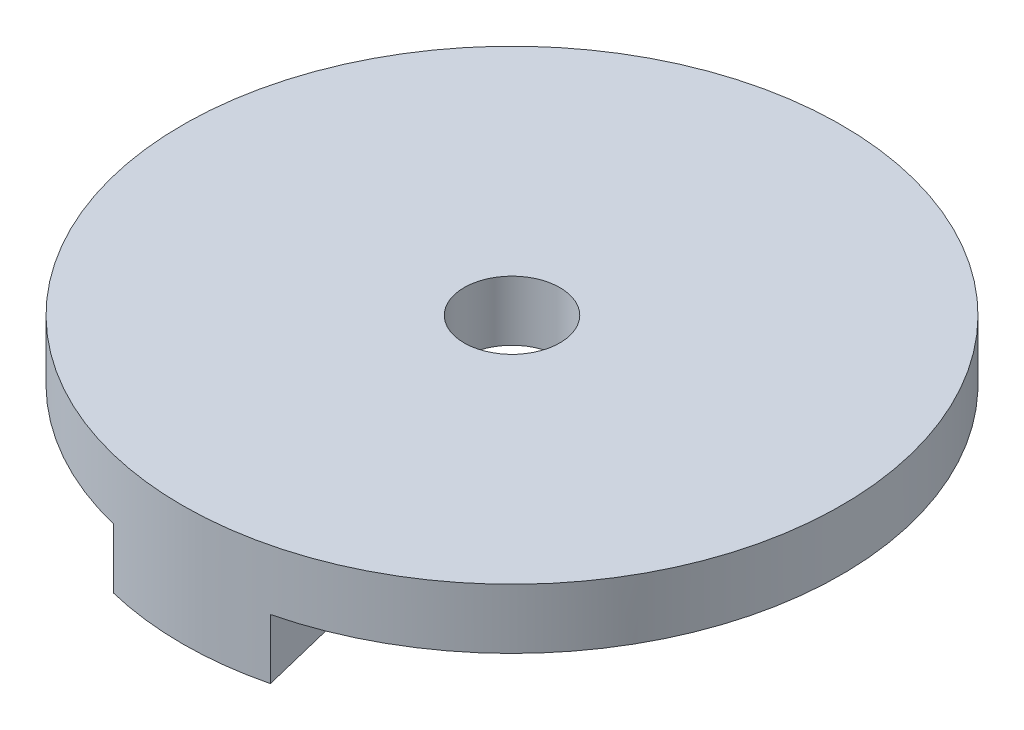
ISO-10303-21;
HEADER;
FILE_DESCRIPTION(('STEP AP214'),'2;1');
FILE_NAME('part.step','',(''),(''),'','','');
FILE_SCHEMA(('AUTOMOTIVE_DESIGN { 1 0 10303 214 1 1 1 1 }'));
ENDSEC;
DATA;
#1=APPLICATION_CONTEXT('core data for automotive mechanical design processes');
#2=APPLICATION_PROTOCOL_DEFINITION('international standard','automotive_design',2000,#1);
#3=PRODUCT_CONTEXT('',#1,'mechanical');
#4=PRODUCT('Part','Part','',(#3));
#5=PRODUCT_RELATED_PRODUCT_CATEGORY('part','',(#4));
#6=PRODUCT_DEFINITION_FORMATION('','',#4);
#7=PRODUCT_DEFINITION_CONTEXT('part definition',#1,'design');
#8=PRODUCT_DEFINITION('design','',#6,#7);
#9=PRODUCT_DEFINITION_SHAPE('','',#8);
#10=(LENGTH_UNIT() NAMED_UNIT(*) SI_UNIT(.MILLI.,.METRE.));
#11=(NAMED_UNIT(*) PLANE_ANGLE_UNIT() SI_UNIT($,.RADIAN.));
#12=(NAMED_UNIT(*) SI_UNIT($,.STERADIAN.) SOLID_ANGLE_UNIT());
#13=UNCERTAINTY_MEASURE_WITH_UNIT(LENGTH_MEASURE(1.E-05),#10,'distance_accuracy_value','');
#14=(GEOMETRIC_REPRESENTATION_CONTEXT(3) GLOBAL_UNCERTAINTY_ASSIGNED_CONTEXT((#13)) GLOBAL_UNIT_ASSIGNED_CONTEXT((#10,
#11,#12)) REPRESENTATION_CONTEXT('',''));
#15=CARTESIAN_POINT('',(0.,0.,0.));
#16=DIRECTION('',(0.,0.,1.));
#17=DIRECTION('',(1.,0.,0.));
#18=AXIS2_PLACEMENT_3D('',#15,#16,#17);
#19=CARTESIAN_POINT('',(0.,0.,0.));
#20=DIRECTION('',(0.,1.,0.));
#21=DIRECTION('',(0.,0.,1.));
#22=AXIS2_PLACEMENT_3D('',#19,#20,#21);
#23=PLANE('',#22);
#24=CARTESIAN_POINT('',(0.,0.,0.));
#25=DIRECTION('',(0.,1.,0.));
#26=DIRECTION('',(0.,0.,1.));
#27=AXIS2_PLACEMENT_3D('',#24,#25,#26);
#28=CIRCLE('',#27,5.08);
#29=CARTESIAN_POINT('',(0.,0.,5.08));
#30=VERTEX_POINT('',#29);
#31=EDGE_CURVE('E94',#30,#30,#28,.T.);
#32=ORIENTED_EDGE('',*,*,#31,.T.);
#33=EDGE_LOOP('',(#32));
#34=FACE_BOUND('',#33,.T.);
#35=DIRECTION('',(0.238095238095238,0.,-0.971241812112911));
#36=VECTOR('',#35,1.);
#37=CARTESIAN_POINT('',(-6.35,0.,25.9030191290513));
#38=LINE('',#37,#36);
#39=CARTESIAN_POINT('',(-8.3154761904762,0.,33.9206202880434));
#40=VERTEX_POINT('',#39);
#41=CARTESIAN_POINT('',(-6.35,0.,25.9030191290513));
#42=VERTEX_POINT('',#41);
#43=EDGE_CURVE('E91',#40,#42,#38,.T.);
#44=ORIENTED_EDGE('',*,*,#43,.F.);
#45=CARTESIAN_POINT('',(0.,0.,0.));
#46=DIRECTION('',(0.,1.,0.));
#47=DIRECTION('',(0.,0.,1.));
#48=AXIS2_PLACEMENT_3D('',#45,#46,#47);
#49=CIRCLE('',#48,34.925);
#50=CARTESIAN_POINT('',(8.31547619047619,0.,33.9206202880434));
#51=VERTEX_POINT('',#50);
#52=EDGE_CURVE('E37',#51,#40,#49,.T.);
#53=ORIENTED_EDGE('',*,*,#52,.F.);
#54=DIRECTION('',(0.238095238095238,0.,0.971241812112911));
#55=VECTOR('',#54,1.);
#56=CARTESIAN_POINT('',(6.35,0.,25.9030191290513));
#57=LINE('',#56,#55);
#58=CARTESIAN_POINT('',(6.35,0.,25.9030191290513));
#59=VERTEX_POINT('',#58);
#60=EDGE_CURVE('E53',#59,#51,#57,.T.);
#61=ORIENTED_EDGE('',*,*,#60,.F.);
#62=CARTESIAN_POINT('',(0.,0.,0.));
#63=DIRECTION('',(0.,1.,0.));
#64=DIRECTION('',(0.,0.,-1.));
#65=AXIS2_PLACEMENT_3D('',#62,#63,#64);
#66=CIRCLE('',#65,26.67);
#67=EDGE_CURVE('E48',#42,#59,#66,.T.);
#68=ORIENTED_EDGE('',*,*,#67,.F.);
#69=EDGE_LOOP('',(#44,#53,#61,#68));
#70=FACE_BOUND('',#69,.T.);
#71=ADVANCED_FACE('F33',(#34,#70),#23,.F.);
#72=CARTESIAN_POINT('',(0.,6.35,0.));
#73=DIRECTION('',(0.,1.,0.));
#74=DIRECTION('',(0.,0.,1.));
#75=AXIS2_PLACEMENT_3D('',#72,#73,#74);
#76=PLANE('',#75);
#77=CARTESIAN_POINT('',(0.,6.35,0.));
#78=DIRECTION('',(0.,1.,0.));
#79=DIRECTION('',(0.,0.,1.));
#80=AXIS2_PLACEMENT_3D('',#77,#78,#79);
#81=CIRCLE('',#80,34.925);
#82=CARTESIAN_POINT('',(0.,6.35,34.925));
#83=VERTEX_POINT('',#82);
#84=EDGE_CURVE('E11',#83,#83,#81,.T.);
#85=ORIENTED_EDGE('',*,*,#84,.T.);
#86=EDGE_LOOP('',(#85));
#87=FACE_BOUND('',#86,.T.);
#88=CARTESIAN_POINT('',(0.,6.35,0.));
#89=DIRECTION('',(0.,1.,0.));
#90=DIRECTION('',(0.,0.,1.));
#91=AXIS2_PLACEMENT_3D('',#88,#89,#90);
#92=CIRCLE('',#91,5.08);
#93=CARTESIAN_POINT('',(0.,6.35,5.08));
#94=VERTEX_POINT('',#93);
#95=EDGE_CURVE('E97',#94,#94,#92,.T.);
#96=ORIENTED_EDGE('',*,*,#95,.F.);
#97=EDGE_LOOP('',(#96));
#98=FACE_BOUND('',#97,.T.);
#99=ADVANCED_FACE('F120',(#87,#98),#76,.T.);
#100=CARTESIAN_POINT('',(0.,6.35,0.));
#101=DIRECTION('',(0.,-1.,0.));
#102=DIRECTION('',(0.,0.,-1.));
#103=AXIS2_PLACEMENT_3D('',#100,#101,#102);
#104=CYLINDRICAL_SURFACE('',#103,34.925);
#105=ORIENTED_EDGE('',*,*,#84,.F.);
#106=EDGE_LOOP('',(#105));
#107=FACE_BOUND('',#106,.T.);
#108=ORIENTED_EDGE('',*,*,#52,.T.);
#109=DIRECTION('',(0.,1.,0.));
#110=VECTOR('',#109,1.);
#111=CARTESIAN_POINT('',(-8.31547619047618,-6.35,33.9206202880434));
#112=LINE('',#111,#110);
#113=CARTESIAN_POINT('',(-8.31547619047618,-6.35,33.9206202880434));
#114=VERTEX_POINT('',#113);
#115=EDGE_CURVE('E99',#114,#40,#112,.T.);
#116=ORIENTED_EDGE('',*,*,#115,.F.);
#117=CARTESIAN_POINT('',(0.,-6.35,0.));
#118=DIRECTION('',(0.,-1.,0.));
#119=DIRECTION('',(0.,0.,-1.));
#120=AXIS2_PLACEMENT_3D('',#117,#118,#119);
#121=CIRCLE('',#120,34.925);
#122=CARTESIAN_POINT('',(8.31547619047619,-6.35,33.9206202880434));
#123=VERTEX_POINT('',#122);
#124=EDGE_CURVE('E81',#123,#114,#121,.T.);
#125=ORIENTED_EDGE('',*,*,#124,.F.);
#126=DIRECTION('',(0.,1.,0.));
#127=VECTOR('',#126,1.);
#128=CARTESIAN_POINT('',(8.31547619047619,-6.35,33.9206202880434));
#129=LINE('',#128,#127);
#130=EDGE_CURVE('E78',#123,#51,#129,.T.);
#131=ORIENTED_EDGE('',*,*,#130,.T.);
#132=EDGE_LOOP('',(#108,#116,#125,#131));
#133=FACE_BOUND('',#132,.T.);
#134=ADVANCED_FACE('F35',(#107,#133),#104,.T.);
#135=CARTESIAN_POINT('',(0.,6.35,0.));
#136=DIRECTION('',(0.,-1.,0.));
#137=DIRECTION('',(0.,0.,-1.));
#138=AXIS2_PLACEMENT_3D('',#135,#136,#137);
#139=CYLINDRICAL_SURFACE('',#138,5.08);
#140=ORIENTED_EDGE('',*,*,#95,.T.);
#141=EDGE_LOOP('',(#140));
#142=FACE_BOUND('',#141,.T.);
#143=ORIENTED_EDGE('',*,*,#31,.F.);
#144=EDGE_LOOP('',(#143));
#145=FACE_BOUND('',#144,.T.);
#146=ADVANCED_FACE('F128',(#142,#145),#139,.F.);
#147=CARTESIAN_POINT('',(0.,-6.35,0.));
#148=DIRECTION('',(0.,1.,0.));
#149=DIRECTION('',(0.,0.,1.));
#150=AXIS2_PLACEMENT_3D('',#147,#148,#149);
#151=CYLINDRICAL_SURFACE('',#150,26.67);
#152=ORIENTED_EDGE('',*,*,#67,.T.);
#153=DIRECTION('',(0.,1.,0.));
#154=VECTOR('',#153,1.);
#155=CARTESIAN_POINT('',(6.35,-6.35,25.9030191290513));
#156=LINE('',#155,#154);
#157=CARTESIAN_POINT('',(6.35,-6.35,25.9030191290513));
#158=VERTEX_POINT('',#157);
#159=EDGE_CURVE('E76',#158,#59,#156,.T.);
#160=ORIENTED_EDGE('',*,*,#159,.F.);
#161=CARTESIAN_POINT('',(0.,-6.35,0.));
#162=DIRECTION('',(0.,1.,0.));
#163=DIRECTION('',(0.,0.,-1.));
#164=AXIS2_PLACEMENT_3D('',#161,#162,#163);
#165=CIRCLE('',#164,26.67);
#166=CARTESIAN_POINT('',(-6.35,-6.35,25.9030191290513));
#167=VERTEX_POINT('',#166);
#168=EDGE_CURVE('E82',#167,#158,#165,.T.);
#169=ORIENTED_EDGE('',*,*,#168,.F.);
#170=DIRECTION('',(0.,1.,0.));
#171=VECTOR('',#170,1.);
#172=CARTESIAN_POINT('',(-6.35,-6.35,25.9030191290513));
#173=LINE('',#172,#171);
#174=EDGE_CURVE('E112',#167,#42,#173,.T.);
#175=ORIENTED_EDGE('',*,*,#174,.T.);
#176=EDGE_LOOP('',(#152,#160,#169,#175));
#177=FACE_BOUND('',#176,.T.);
#178=ADVANCED_FACE('F93',(#177),#151,.F.);
#179=CARTESIAN_POINT('',(6.35,-6.35,25.9030191290513));
#180=DIRECTION('',(-0.971241812112911,0.,0.238095238095238));
#181=DIRECTION('',(0.238095238095238,0.,0.971241812112911));
#182=AXIS2_PLACEMENT_3D('',#179,#180,#181);
#183=PLANE('',#182);
#184=ORIENTED_EDGE('',*,*,#60,.T.);
#185=ORIENTED_EDGE('',*,*,#130,.F.);
#186=DIRECTION('',(0.238095238095238,0.,0.971241812112911));
#187=VECTOR('',#186,1.);
#188=CARTESIAN_POINT('',(6.35,-6.35,25.9030191290513));
#189=LINE('',#188,#187);
#190=EDGE_CURVE('E72',#158,#123,#189,.T.);
#191=ORIENTED_EDGE('',*,*,#190,.F.);
#192=ORIENTED_EDGE('',*,*,#159,.T.);
#193=EDGE_LOOP('',(#184,#185,#191,#192));
#194=FACE_BOUND('',#193,.T.);
#195=ADVANCED_FACE('F74',(#194),#183,.F.);
#196=CARTESIAN_POINT('',(-6.35,-6.35,25.9030191290513));
#197=DIRECTION('',(0.971241812112911,0.,0.238095238095238));
#198=DIRECTION('',(0.238095238095238,0.,-0.971241812112911));
#199=AXIS2_PLACEMENT_3D('',#196,#197,#198);
#200=PLANE('',#199);
#201=ORIENTED_EDGE('',*,*,#43,.T.);
#202=ORIENTED_EDGE('',*,*,#174,.F.);
#203=DIRECTION('',(0.238095238095238,0.,-0.971241812112911));
#204=VECTOR('',#203,1.);
#205=CARTESIAN_POINT('',(-6.35,-6.35,25.9030191290513));
#206=LINE('',#205,#204);
#207=EDGE_CURVE('E87',#114,#167,#206,.T.);
#208=ORIENTED_EDGE('',*,*,#207,.F.);
#209=ORIENTED_EDGE('',*,*,#115,.T.);
#210=EDGE_LOOP('',(#201,#202,#208,#209));
#211=FACE_BOUND('',#210,.T.);
#212=ADVANCED_FACE('F111',(#211),#200,.F.);
#213=CARTESIAN_POINT('',(0.,-6.35,0.));
#214=DIRECTION('',(0.,-1.,0.));
#215=DIRECTION('',(0.,0.,-1.));
#216=AXIS2_PLACEMENT_3D('',#213,#214,#215);
#217=PLANE('',#216);
#218=ORIENTED_EDGE('',*,*,#168,.T.);
#219=ORIENTED_EDGE('',*,*,#190,.T.);
#220=ORIENTED_EDGE('',*,*,#124,.T.);
#221=ORIENTED_EDGE('',*,*,#207,.T.);
#222=EDGE_LOOP('',(#218,#219,#220,#221));
#223=FACE_BOUND('',#222,.T.);
#224=ADVANCED_FACE('F85',(#223),#217,.T.);
#225=CLOSED_SHELL('',(#71,#99,#134,#146,#178,#195,#212,#224));
#226=MANIFOLD_SOLID_BREP('B2',#225);
#227=ADVANCED_BREP_SHAPE_REPRESENTATION('',(#18,#226),#14);
#228=SHAPE_DEFINITION_REPRESENTATION(#9,#227);
ENDSEC;
END-ISO-10303-21;
